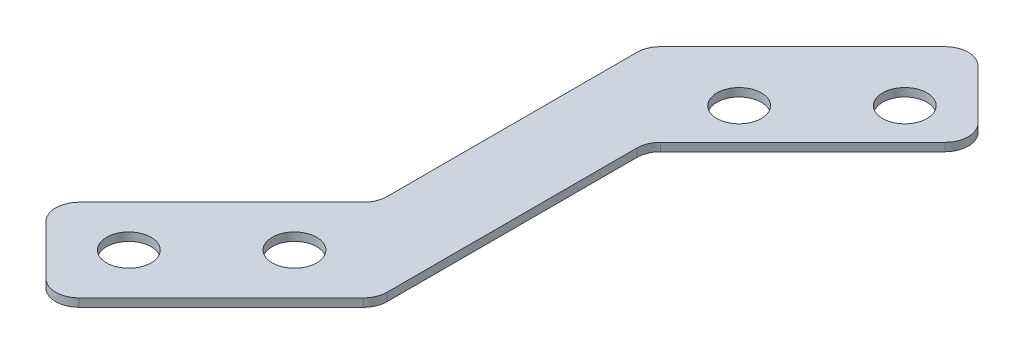
ISO-10303-21;
HEADER;
FILE_DESCRIPTION(('STEP AP214'),'2;1');
FILE_NAME('part.step','',(''),(''),'','','');
FILE_SCHEMA(('AUTOMOTIVE_DESIGN { 1 0 10303 214 1 1 1 1 }'));
ENDSEC;
DATA;
#1=APPLICATION_CONTEXT('core data for automotive mechanical design processes');
#2=APPLICATION_PROTOCOL_DEFINITION('international standard','automotive_design',2000,#1);
#3=PRODUCT_CONTEXT('',#1,'mechanical');
#4=PRODUCT('Part','Part','',(#3));
#5=PRODUCT_RELATED_PRODUCT_CATEGORY('part','',(#4));
#6=PRODUCT_DEFINITION_FORMATION('','',#4);
#7=PRODUCT_DEFINITION_CONTEXT('part definition',#1,'design');
#8=PRODUCT_DEFINITION('design','',#6,#7);
#9=PRODUCT_DEFINITION_SHAPE('','',#8);
#10=(LENGTH_UNIT() NAMED_UNIT(*) SI_UNIT(.MILLI.,.METRE.));
#11=(NAMED_UNIT(*) PLANE_ANGLE_UNIT() SI_UNIT($,.RADIAN.));
#12=(NAMED_UNIT(*) SI_UNIT($,.STERADIAN.) SOLID_ANGLE_UNIT());
#13=UNCERTAINTY_MEASURE_WITH_UNIT(LENGTH_MEASURE(1.E-05),#10,'distance_accuracy_value','');
#14=(GEOMETRIC_REPRESENTATION_CONTEXT(3) GLOBAL_UNCERTAINTY_ASSIGNED_CONTEXT((#13)) GLOBAL_UNIT_ASSIGNED_CONTEXT((#10,
#11,#12)) REPRESENTATION_CONTEXT('',''));
#15=CARTESIAN_POINT('',(0.,0.,0.));
#16=DIRECTION('',(0.,0.,1.));
#17=DIRECTION('',(1.,0.,0.));
#18=AXIS2_PLACEMENT_3D('',#15,#16,#17);
#19=CARTESIAN_POINT('',(-14.142135623731,-0.7,14.1421356237309));
#20=DIRECTION('',(0.707106781186547,0.,0.707106781186549));
#21=DIRECTION('',(0.707106781186549,0.,-0.707106781186547));
#22=AXIS2_PLACEMENT_3D('',#19,#20,#21);
#23=PLANE('',#22);
#24=DIRECTION('',(0.707106781186548,0.,-0.707106781186546));
#25=VECTOR('',#24,1.);
#26=CARTESIAN_POINT('',(-14.142135623731,-0.7,14.1421356237309));
#27=LINE('',#26,#25);
#28=CARTESIAN_POINT('',(-12.7279220613579,-0.7,12.7279220613578));
#29=VERTEX_POINT('',#28);
#30=CARTESIAN_POINT('',(-0.585786437626905,-0.7,0.585786437626903));
#31=VERTEX_POINT('',#30);
#32=EDGE_CURVE('E255',#29,#31,#27,.T.);
#33=ORIENTED_EDGE('',*,*,#32,.T.);
#34=DIRECTION('',(0.,1.,0.));
#35=VECTOR('',#34,1.);
#36=CARTESIAN_POINT('',(-0.585786437626903,-0.7,0.585786437626901));
#37=LINE('',#36,#35);
#38=CARTESIAN_POINT('',(-0.585786437626905,0.,0.585786437626903));
#39=VERTEX_POINT('',#38);
#40=EDGE_CURVE('E230',#31,#39,#37,.T.);
#41=ORIENTED_EDGE('',*,*,#40,.T.);
#42=DIRECTION('',(0.707106781186548,0.,-0.707106781186546));
#43=VECTOR('',#42,1.);
#44=CARTESIAN_POINT('',(-14.142135623731,0.,14.1421356237309));
#45=LINE('',#44,#43);
#46=CARTESIAN_POINT('',(-12.7279220613579,0.,12.7279220613578));
#47=VERTEX_POINT('',#46);
#48=EDGE_CURVE('E272',#47,#39,#45,.T.);
#49=ORIENTED_EDGE('',*,*,#48,.F.);
#50=DIRECTION('',(0.,1.,0.));
#51=VECTOR('',#50,1.);
#52=CARTESIAN_POINT('',(-12.7279220613579,-0.7,12.7279220613578));
#53=LINE('',#52,#51);
#54=EDGE_CURVE('E228',#47,#29,#53,.F.);
#55=ORIENTED_EDGE('',*,*,#54,.T.);
#56=EDGE_LOOP('',(#33,#41,#49,#55));
#57=FACE_BOUND('',#56,.T.);
#58=ADVANCED_FACE('F37',(#57),#23,.T.);
#59=CARTESIAN_POINT('',(-14.142135623731,-0.7,14.1421356237309));
#60=DIRECTION('',(-0.707106781186549,0.,0.707106781186547));
#61=DIRECTION('',(0.707106781186547,0.,0.707106781186549));
#62=AXIS2_PLACEMENT_3D('',#59,#60,#61);
#63=PLANE('',#62);
#64=DIRECTION('',(0.707106781186546,0.,0.707106781186548));
#65=VECTOR('',#64,1.);
#66=CARTESIAN_POINT('',(-14.142135623731,0.,14.1421356237309));
#67=LINE('',#66,#65);
#68=CARTESIAN_POINT('',(-19.7989898732233,0.,8.48528137423854));
#69=VERTEX_POINT('',#68);
#70=CARTESIAN_POINT('',(-15.5563491861041,0.,12.7279220613578));
#71=VERTEX_POINT('',#70);
#72=EDGE_CURVE('E184',#69,#71,#67,.T.);
#73=ORIENTED_EDGE('',*,*,#72,.F.);
#74=DIRECTION('',(0.,1.,0.));
#75=VECTOR('',#74,1.);
#76=CARTESIAN_POINT('',(-19.7989898732233,-0.7,8.48528137423854));
#77=LINE('',#76,#75);
#78=CARTESIAN_POINT('',(-19.7989898732233,-0.7,8.48528137423854));
#79=VERTEX_POINT('',#78);
#80=EDGE_CURVE('E236',#69,#79,#77,.F.);
#81=ORIENTED_EDGE('',*,*,#80,.T.);
#82=DIRECTION('',(0.707106781186546,0.,0.707106781186548));
#83=VECTOR('',#82,1.);
#84=CARTESIAN_POINT('',(-14.142135623731,-0.7,14.1421356237309));
#85=LINE('',#84,#83);
#86=CARTESIAN_POINT('',(-15.5563491861041,-0.7,12.7279220613578));
#87=VERTEX_POINT('',#86);
#88=EDGE_CURVE('E176',#79,#87,#85,.T.);
#89=ORIENTED_EDGE('',*,*,#88,.T.);
#90=DIRECTION('',(0.,1.,0.));
#91=VECTOR('',#90,1.);
#92=CARTESIAN_POINT('',(-15.5563491861041,-0.7,12.7279220613578));
#93=LINE('',#92,#91);
#94=EDGE_CURVE('E233',#87,#71,#93,.T.);
#95=ORIENTED_EDGE('',*,*,#94,.T.);
#96=EDGE_LOOP('',(#73,#81,#89,#95));
#97=FACE_BOUND('',#96,.T.);
#98=ADVANCED_FACE('F289',(#97),#63,.T.);
#99=CARTESIAN_POINT('',(-7.07106781186555,-0.7,-7.0710678118654));
#100=DIRECTION('',(-0.707106781186547,0.,-0.707106781186548));
#101=DIRECTION('',(-0.707106781186548,0.,0.707106781186547));
#102=AXIS2_PLACEMENT_3D('',#99,#100,#101);
#103=PLANE('',#102);
#104=DIRECTION('',(-0.707106781186549,0.,0.707106781186547));
#105=VECTOR('',#104,1.);
#106=CARTESIAN_POINT('',(-7.07106781186555,0.,-7.0710678118654));
#107=LINE('',#106,#105);
#108=CARTESIAN_POINT('',(-7.65685424949246,0.,-6.48528137423849));
#109=VERTEX_POINT('',#108);
#110=CARTESIAN_POINT('',(-19.7989898732233,0.,5.65685424949236));
#111=VERTEX_POINT('',#110);
#112=EDGE_CURVE('E281',#109,#111,#107,.T.);
#113=ORIENTED_EDGE('',*,*,#112,.F.);
#114=DIRECTION('',(0.,1.,0.));
#115=VECTOR('',#114,1.);
#116=CARTESIAN_POINT('',(-7.65685424949246,-0.7,-6.48528137423849));
#117=LINE('',#116,#115);
#118=CARTESIAN_POINT('',(-7.65685424949246,-0.7,-6.48528137423849));
#119=VERTEX_POINT('',#118);
#120=EDGE_CURVE('E222',#109,#119,#117,.F.);
#121=ORIENTED_EDGE('',*,*,#120,.T.);
#122=DIRECTION('',(-0.707106781186549,0.,0.707106781186547));
#123=VECTOR('',#122,1.);
#124=CARTESIAN_POINT('',(-7.07106781186555,-0.7,-7.0710678118654));
#125=LINE('',#124,#123);
#126=CARTESIAN_POINT('',(-19.7989898732233,-0.7,5.65685424949236));
#127=VERTEX_POINT('',#126);
#128=EDGE_CURVE('E181',#119,#127,#125,.T.);
#129=ORIENTED_EDGE('',*,*,#128,.T.);
#130=DIRECTION('',(0.,1.,0.));
#131=VECTOR('',#130,1.);
#132=CARTESIAN_POINT('',(-19.7989898732233,-0.7,5.65685424949235));
#133=LINE('',#132,#131);
#134=EDGE_CURVE('E219',#127,#111,#133,.T.);
#135=ORIENTED_EDGE('',*,*,#134,.T.);
#136=EDGE_LOOP('',(#113,#121,#129,#135));
#137=FACE_BOUND('',#136,.T.);
#138=ADVANCED_FACE('F301',(#137),#103,.T.);
#139=CARTESIAN_POINT('',(-7.07106781186555,-0.7,-30.0710678118656));
#140=DIRECTION('',(-1.,0.,0.));
#141=DIRECTION('',(0.,0.,1.));
#142=AXIS2_PLACEMENT_3D('',#139,#140,#141);
#143=PLANE('',#142);
#144=DIRECTION('',(0.,0.,1.));
#145=VECTOR('',#144,1.);
#146=CARTESIAN_POINT('',(-7.07106781186555,-0.7,-30.0710678118656));
#147=LINE('',#146,#145);
#148=CARTESIAN_POINT('',(-7.07106781186555,-0.7,-29.2426406871194));
#149=VERTEX_POINT('',#148);
#150=CARTESIAN_POINT('',(-7.07106781186555,-0.7,-7.89949493661159));
#151=VERTEX_POINT('',#150);
#152=EDGE_CURVE('E267',#149,#151,#147,.T.);
#153=ORIENTED_EDGE('',*,*,#152,.T.);
#154=DIRECTION('',(0.,1.,0.));
#155=VECTOR('',#154,1.);
#156=CARTESIAN_POINT('',(-7.07106781186555,0.,-7.89949493661159));
#157=LINE('',#156,#155);
#158=CARTESIAN_POINT('',(-7.07106781186555,0.,-7.89949493661159));
#159=VERTEX_POINT('',#158);
#160=EDGE_CURVE('E216',#151,#159,#157,.T.);
#161=ORIENTED_EDGE('',*,*,#160,.T.);
#162=DIRECTION('',(0.,0.,1.));
#163=VECTOR('',#162,1.);
#164=CARTESIAN_POINT('',(-7.07106781186555,0.,-30.0710678118656));
#165=LINE('',#164,#163);
#166=CARTESIAN_POINT('',(-7.07106781186555,0.,-29.2426406871194));
#167=VERTEX_POINT('',#166);
#168=EDGE_CURVE('E279',#167,#159,#165,.T.);
#169=ORIENTED_EDGE('',*,*,#168,.F.);
#170=DIRECTION('',(0.,1.,0.));
#171=VECTOR('',#170,1.);
#172=CARTESIAN_POINT('',(-7.07106781186555,-0.7,-29.2426406871194));
#173=LINE('',#172,#171);
#174=EDGE_CURVE('E214',#167,#149,#173,.F.);
#175=ORIENTED_EDGE('',*,*,#174,.T.);
#176=EDGE_LOOP('',(#153,#161,#169,#175));
#177=FACE_BOUND('',#176,.T.);
#178=ADVANCED_FACE('F309',(#177),#143,.T.);
#179=CARTESIAN_POINT('',(7.07106781186551,-0.7,-44.2132034355964));
#180=DIRECTION('',(-0.707106781186542,0.,-0.707106781186553));
#181=DIRECTION('',(-0.707106781186553,0.,0.707106781186542));
#182=AXIS2_PLACEMENT_3D('',#179,#180,#181);
#183=PLANE('',#182);
#184=DIRECTION('',(-0.707106781186553,0.,0.707106781186542));
#185=VECTOR('',#184,1.);
#186=CARTESIAN_POINT('',(7.07106781186551,0.,-44.2132034355964));
#187=LINE('',#186,#185);
#188=CARTESIAN_POINT('',(5.65685424949241,0.,-42.7989898732233));
#189=VERTEX_POINT('',#188);
#190=CARTESIAN_POINT('',(-6.48528137423863,0.,-30.6568542494925));
#191=VERTEX_POINT('',#190);
#192=EDGE_CURVE('E171',#189,#191,#187,.T.);
#193=ORIENTED_EDGE('',*,*,#192,.F.);
#194=DIRECTION('',(0.,1.,0.));
#195=VECTOR('',#194,1.);
#196=CARTESIAN_POINT('',(5.65685424949241,-0.7,-42.7989898732233));
#197=LINE('',#196,#195);
#198=CARTESIAN_POINT('',(5.65685424949241,-0.7,-42.7989898732233));
#199=VERTEX_POINT('',#198);
#200=EDGE_CURVE('E197',#189,#199,#197,.F.);
#201=ORIENTED_EDGE('',*,*,#200,.T.);
#202=DIRECTION('',(-0.707106781186553,0.,0.707106781186542));
#203=VECTOR('',#202,1.);
#204=CARTESIAN_POINT('',(7.07106781186551,-0.7,-44.2132034355964));
#205=LINE('',#204,#203);
#206=CARTESIAN_POINT('',(-6.48528137423863,-0.7,-30.6568542494925));
#207=VERTEX_POINT('',#206);
#208=EDGE_CURVE('E264',#199,#207,#205,.T.);
#209=ORIENTED_EDGE('',*,*,#208,.T.);
#210=DIRECTION('',(0.,1.,0.));
#211=VECTOR('',#210,1.);
#212=CARTESIAN_POINT('',(-6.48528137423863,-0.7,-30.6568542494925));
#213=LINE('',#212,#211);
#214=EDGE_CURVE('E194',#207,#191,#213,.T.);
#215=ORIENTED_EDGE('',*,*,#214,.T.);
#216=EDGE_LOOP('',(#193,#201,#209,#215));
#217=FACE_BOUND('',#216,.T.);
#218=ADVANCED_FACE('F318',(#217),#183,.T.);
#219=CARTESIAN_POINT('',(14.142135623731,-0.7,-37.1421356237309));
#220=DIRECTION('',(0.707106781186549,0.,-0.707106781186546));
#221=DIRECTION('',(-0.707106781186546,0.,-0.707106781186549));
#222=AXIS2_PLACEMENT_3D('',#219,#220,#221);
#223=PLANE('',#222);
#224=DIRECTION('',(-0.707106781186546,0.,-0.707106781186549));
#225=VECTOR('',#224,1.);
#226=CARTESIAN_POINT('',(14.142135623731,-0.7,-37.1421356237309));
#227=LINE('',#226,#225);
#228=CARTESIAN_POINT('',(12.7279220613579,-0.7,-38.556349186104));
#229=VERTEX_POINT('',#228);
#230=CARTESIAN_POINT('',(8.48528137423859,-0.7,-42.7989898732233));
#231=VERTEX_POINT('',#230);
#232=EDGE_CURVE('E257',#229,#231,#227,.T.);
#233=ORIENTED_EDGE('',*,*,#232,.T.);
#234=DIRECTION('',(0.,1.,0.));
#235=VECTOR('',#234,1.);
#236=CARTESIAN_POINT('',(8.48528137423859,-0.7,-42.7989898732233));
#237=LINE('',#236,#235);
#238=CARTESIAN_POINT('',(8.48528137423859,0.,-42.7989898732233));
#239=VERTEX_POINT('',#238);
#240=EDGE_CURVE('E170',#231,#239,#237,.T.);
#241=ORIENTED_EDGE('',*,*,#240,.T.);
#242=DIRECTION('',(-0.707106781186546,0.,-0.707106781186549));
#243=VECTOR('',#242,1.);
#244=CARTESIAN_POINT('',(14.142135623731,0.,-37.1421356237309));
#245=LINE('',#244,#243);
#246=CARTESIAN_POINT('',(12.7279220613579,0.,-38.556349186104));
#247=VERTEX_POINT('',#246);
#248=EDGE_CURVE('E153',#247,#239,#245,.T.);
#249=ORIENTED_EDGE('',*,*,#248,.F.);
#250=DIRECTION('',(0.,1.,0.));
#251=VECTOR('',#250,1.);
#252=CARTESIAN_POINT('',(12.7279220613579,-0.7,-38.556349186104));
#253=LINE('',#252,#251);
#254=EDGE_CURVE('E167',#247,#229,#253,.F.);
#255=ORIENTED_EDGE('',*,*,#254,.T.);
#256=EDGE_LOOP('',(#233,#241,#249,#255));
#257=FACE_BOUND('',#256,.T.);
#258=ADVANCED_FACE('F166',(#257),#223,.T.);
#259=CARTESIAN_POINT('',(0.,-0.7,-23.));
#260=DIRECTION('',(0.707106781186546,0.,0.707106781186549));
#261=DIRECTION('',(0.707106781186549,0.,-0.707106781186546));
#262=AXIS2_PLACEMENT_3D('',#259,#260,#261);
#263=PLANE('',#262);
#264=DIRECTION('',(0.707106781186549,0.,-0.707106781186546));
#265=VECTOR('',#264,1.);
#266=CARTESIAN_POINT('',(0.,-0.7,-23.));
#267=LINE('',#266,#265);
#268=CARTESIAN_POINT('',(0.585786437626907,-0.7,-23.5857864376269));
#269=VERTEX_POINT('',#268);
#270=CARTESIAN_POINT('',(12.7279220613579,-0.7,-35.7279220613578));
#271=VERTEX_POINT('',#270);
#272=EDGE_CURVE('E254',#269,#271,#267,.T.);
#273=ORIENTED_EDGE('',*,*,#272,.T.);
#274=DIRECTION('',(0.,1.,0.));
#275=VECTOR('',#274,1.);
#276=CARTESIAN_POINT('',(12.7279220613579,-0.7,-35.7279220613578));
#277=LINE('',#276,#275);
#278=CARTESIAN_POINT('',(12.7279220613579,0.,-35.7279220613578));
#279=VERTEX_POINT('',#278);
#280=EDGE_CURVE('E212',#271,#279,#277,.T.);
#281=ORIENTED_EDGE('',*,*,#280,.T.);
#282=DIRECTION('',(0.707106781186549,0.,-0.707106781186546));
#283=VECTOR('',#282,1.);
#284=CARTESIAN_POINT('',(0.,0.,-23.));
#285=LINE('',#284,#283);
#286=CARTESIAN_POINT('',(0.585786437626907,0.,-23.5857864376269));
#287=VERTEX_POINT('',#286);
#288=EDGE_CURVE('E155',#287,#279,#285,.T.);
#289=ORIENTED_EDGE('',*,*,#288,.F.);
#290=DIRECTION('',(0.,1.,0.));
#291=VECTOR('',#290,1.);
#292=CARTESIAN_POINT('',(0.585786437626907,-0.7,-23.5857864376269));
#293=LINE('',#292,#291);
#294=EDGE_CURVE('E210',#287,#269,#293,.F.);
#295=ORIENTED_EDGE('',*,*,#294,.T.);
#296=EDGE_LOOP('',(#273,#281,#289,#295));
#297=FACE_BOUND('',#296,.T.);
#298=ADVANCED_FACE('F248',(#297),#263,.T.);
#299=CARTESIAN_POINT('',(0.,-0.7,0.));
#300=DIRECTION('',(1.,0.,0.));
#301=DIRECTION('',(0.,0.,-1.));
#302=AXIS2_PLACEMENT_3D('',#299,#300,#301);
#303=PLANE('',#302);
#304=DIRECTION('',(0.,0.,-1.));
#305=VECTOR('',#304,1.);
#306=CARTESIAN_POINT('',(0.,-0.7,0.));
#307=LINE('',#306,#305);
#308=CARTESIAN_POINT('',(0.,-0.7,-0.828427124746194));
#309=VERTEX_POINT('',#308);
#310=CARTESIAN_POINT('',(0.,-0.7,-22.1715728752538));
#311=VERTEX_POINT('',#310);
#312=EDGE_CURVE('E252',#309,#311,#307,.T.);
#313=ORIENTED_EDGE('',*,*,#312,.T.);
#314=DIRECTION('',(0.,1.,0.));
#315=VECTOR('',#314,1.);
#316=CARTESIAN_POINT('',(0.,0.,-22.1715728752538));
#317=LINE('',#316,#315);
#318=CARTESIAN_POINT('',(0.,0.,-22.1715728752538));
#319=VERTEX_POINT('',#318);
#320=EDGE_CURVE('E225',#311,#319,#317,.T.);
#321=ORIENTED_EDGE('',*,*,#320,.T.);
#322=DIRECTION('',(0.,0.,-1.));
#323=VECTOR('',#322,1.);
#324=CARTESIAN_POINT('',(0.,0.,0.));
#325=LINE('',#324,#323);
#326=CARTESIAN_POINT('',(0.,0.,-0.828427124746194));
#327=VERTEX_POINT('',#326);
#328=EDGE_CURVE('E242',#327,#319,#325,.T.);
#329=ORIENTED_EDGE('',*,*,#328,.F.);
#330=DIRECTION('',(0.,1.,0.));
#331=VECTOR('',#330,1.);
#332=CARTESIAN_POINT('',(0.,-0.7,-0.828427124746194));
#333=LINE('',#332,#331);
#334=EDGE_CURVE('E57',#327,#309,#333,.F.);
#335=ORIENTED_EDGE('',*,*,#334,.T.);
#336=EDGE_LOOP('',(#313,#321,#329,#335));
#337=FACE_BOUND('',#336,.T.);
#338=ADVANCED_FACE('F251',(#337),#303,.T.);
#339=CARTESIAN_POINT('',(0.,-0.7,0.));
#340=DIRECTION('',(0.,1.,0.));
#341=DIRECTION('',(0.,0.,1.));
#342=AXIS2_PLACEMENT_3D('',#339,#340,#341);
#343=PLANE('',#342);
#344=CARTESIAN_POINT('',(-14.1398215405069,-0.699999999999999,7.07338189508951));
#345=DIRECTION('',(0.,1.,0.));
#346=DIRECTION('',(0.,0.,1.));
#347=AXIS2_PLACEMENT_3D('',#344,#345,#346);
#348=CIRCLE('',#347,1.89864999999999);
#349=CARTESIAN_POINT('',(-14.1398215405069,-0.699999999999999,8.9720318950895));
#350=VERTEX_POINT('',#349);
#351=EDGE_CURVE('E379',#350,#350,#348,.T.);
#352=ORIENTED_EDGE('',*,*,#351,.T.);
#353=EDGE_LOOP('',(#352));
#354=FACE_BOUND('',#353,.T.);
#355=CARTESIAN_POINT('',(-7.06875372864142,-0.699999999999999,0.00231408322403509));
#356=DIRECTION('',(0.,1.,0.));
#357=DIRECTION('',(0.,0.,1.));
#358=AXIS2_PLACEMENT_3D('',#355,#356,#357);
#359=CIRCLE('',#358,1.89864999999999);
#360=CARTESIAN_POINT('',(-7.06875372864142,-0.699999999999999,1.90096408322403));
#361=VERTEX_POINT('',#360);
#362=EDGE_CURVE('E374',#361,#361,#359,.T.);
#363=ORIENTED_EDGE('',*,*,#362,.T.);
#364=EDGE_LOOP('',(#363));
#365=FACE_BOUND('',#364,.T.);
#366=CARTESIAN_POINT('',(1.23743686707645,-0.699999999999999,-29.6538748109654));
#367=DIRECTION('',(0.,1.,0.));
#368=DIRECTION('',(0.,0.,1.));
#369=AXIS2_PLACEMENT_3D('',#366,#367,#368);
#370=CIRCLE('',#369,1.89865);
#371=CARTESIAN_POINT('',(1.23743686707645,-0.699999999999999,-27.7552248109654));
#372=VERTEX_POINT('',#371);
#373=EDGE_CURVE('E390',#372,#372,#370,.T.);
#374=ORIENTED_EDGE('',*,*,#373,.T.);
#375=EDGE_LOOP('',(#374));
#376=FACE_BOUND('',#375,.T.);
#377=CARTESIAN_POINT('',(8.30850467894193,-0.699999999999999,-36.7249426228309));
#378=DIRECTION('',(0.,1.,0.));
#379=DIRECTION('',(0.,0.,1.));
#380=AXIS2_PLACEMENT_3D('',#377,#378,#379);
#381=CIRCLE('',#380,1.89864999999999);
#382=CARTESIAN_POINT('',(8.30850467894193,-0.699999999999999,-34.8262926228309));
#383=VERTEX_POINT('',#382);
#384=EDGE_CURVE('E275',#383,#383,#381,.T.);
#385=ORIENTED_EDGE('',*,*,#384,.T.);
#386=EDGE_LOOP('',(#385));
#387=FACE_BOUND('',#386,.T.);
#388=ORIENTED_EDGE('',*,*,#208,.F.);
#389=CARTESIAN_POINT('',(7.07106781186549,-0.7,-41.3847763108502));
#390=DIRECTION('',(0.,1.,0.));
#391=DIRECTION('',(0.,0.,1.));
#392=AXIS2_PLACEMENT_3D('',#389,#390,#391);
#393=CIRCLE('',#392,2.);
#394=EDGE_CURVE('E208',#199,#231,#393,.F.);
#395=ORIENTED_EDGE('',*,*,#394,.T.);
#396=ORIENTED_EDGE('',*,*,#232,.F.);
#397=CARTESIAN_POINT('',(11.3137084989848,-0.7,-37.1421356237309));
#398=DIRECTION('',(0.,1.,0.));
#399=DIRECTION('',(0.,0.,1.));
#400=AXIS2_PLACEMENT_3D('',#397,#398,#399);
#401=CIRCLE('',#400,2.);
#402=EDGE_CURVE('E175',#229,#271,#401,.F.);
#403=ORIENTED_EDGE('',*,*,#402,.T.);
#404=ORIENTED_EDGE('',*,*,#272,.F.);
#405=CARTESIAN_POINT('',(2.,-0.7,-22.1715728752538));
#406=DIRECTION('',(0.,1.,0.));
#407=DIRECTION('',(0.,0.,1.));
#408=AXIS2_PLACEMENT_3D('',#405,#406,#407);
#409=CIRCLE('',#408,2.);
#410=EDGE_CURVE('E11',#269,#311,#409,.T.);
#411=ORIENTED_EDGE('',*,*,#410,.T.);
#412=ORIENTED_EDGE('',*,*,#312,.F.);
#413=CARTESIAN_POINT('',(-2.,-0.7,-0.828427124746194));
#414=DIRECTION('',(0.,1.,0.));
#415=DIRECTION('',(0.,0.,1.));
#416=AXIS2_PLACEMENT_3D('',#413,#414,#415);
#417=CIRCLE('',#416,2.);
#418=EDGE_CURVE('E203',#309,#31,#417,.F.);
#419=ORIENTED_EDGE('',*,*,#418,.T.);
#420=ORIENTED_EDGE('',*,*,#32,.F.);
#421=CARTESIAN_POINT('',(-14.142135623731,-0.7,11.3137084989847));
#422=DIRECTION('',(0.,1.,0.));
#423=DIRECTION('',(0.,0.,1.));
#424=AXIS2_PLACEMENT_3D('',#421,#422,#423);
#425=CIRCLE('',#424,2.);
#426=EDGE_CURVE('E199',#29,#87,#425,.F.);
#427=ORIENTED_EDGE('',*,*,#426,.T.);
#428=ORIENTED_EDGE('',*,*,#88,.F.);
#429=CARTESIAN_POINT('',(-18.3847763108502,-0.7,7.07106781186545));
#430=DIRECTION('',(0.,1.,0.));
#431=DIRECTION('',(0.,0.,1.));
#432=AXIS2_PLACEMENT_3D('',#429,#430,#431);
#433=CIRCLE('',#432,2.);
#434=EDGE_CURVE('E201',#79,#127,#433,.F.);
#435=ORIENTED_EDGE('',*,*,#434,.T.);
#436=ORIENTED_EDGE('',*,*,#128,.F.);
#437=CARTESIAN_POINT('',(-9.07106781186555,-0.7,-7.89949493661159));
#438=DIRECTION('',(0.,1.,0.));
#439=DIRECTION('',(0.,0.,1.));
#440=AXIS2_PLACEMENT_3D('',#437,#438,#439);
#441=CIRCLE('',#440,2.);
#442=EDGE_CURVE('E240',#119,#151,#441,.T.);
#443=ORIENTED_EDGE('',*,*,#442,.T.);
#444=ORIENTED_EDGE('',*,*,#152,.F.);
#445=CARTESIAN_POINT('',(-5.07106781186555,-0.7,-29.2426406871194));
#446=DIRECTION('',(0.,1.,0.));
#447=DIRECTION('',(0.,0.,1.));
#448=AXIS2_PLACEMENT_3D('',#445,#446,#447);
#449=CIRCLE('',#448,2.);
#450=EDGE_CURVE('E205',#149,#207,#449,.F.);
#451=ORIENTED_EDGE('',*,*,#450,.T.);
#452=EDGE_LOOP('',(#388,#395,#396,#403,#404,#411,#412,#419,#420,#427,#428,#435,#436,#443,#444,#451));
#453=FACE_BOUND('',#452,.T.);
#454=ADVANCED_FACE('F298',(#354,#365,#376,#387,#453),#343,.F.);
#455=CARTESIAN_POINT('',(0.,0.,0.));
#456=DIRECTION('',(0.,1.,0.));
#457=DIRECTION('',(0.,0.,1.));
#458=AXIS2_PLACEMENT_3D('',#455,#456,#457);
#459=PLANE('',#458);
#460=CARTESIAN_POINT('',(-14.1398215405069,0.,7.07338189508951));
#461=DIRECTION('',(0.,1.,0.));
#462=DIRECTION('',(0.,0.,1.));
#463=AXIS2_PLACEMENT_3D('',#460,#461,#462);
#464=CIRCLE('',#463,1.89864999999999);
#465=CARTESIAN_POINT('',(-14.1398215405069,0.,8.9720318950895));
#466=VERTEX_POINT('',#465);
#467=EDGE_CURVE('E384',#466,#466,#464,.T.);
#468=ORIENTED_EDGE('',*,*,#467,.F.);
#469=EDGE_LOOP('',(#468));
#470=FACE_BOUND('',#469,.T.);
#471=CARTESIAN_POINT('',(-7.06875372864142,0.,0.00231408322403509));
#472=DIRECTION('',(0.,1.,0.));
#473=DIRECTION('',(0.,0.,1.));
#474=AXIS2_PLACEMENT_3D('',#471,#472,#473);
#475=CIRCLE('',#474,1.89864999999999);
#476=CARTESIAN_POINT('',(-7.06875372864142,0.,1.90096408322402));
#477=VERTEX_POINT('',#476);
#478=EDGE_CURVE('E377',#477,#477,#475,.T.);
#479=ORIENTED_EDGE('',*,*,#478,.F.);
#480=EDGE_LOOP('',(#479));
#481=FACE_BOUND('',#480,.T.);
#482=CARTESIAN_POINT('',(1.23743686707645,0.,-29.6538748109654));
#483=DIRECTION('',(0.,1.,0.));
#484=DIRECTION('',(0.,0.,1.));
#485=AXIS2_PLACEMENT_3D('',#482,#483,#484);
#486=CIRCLE('',#485,1.89864999999999);
#487=CARTESIAN_POINT('',(1.23743686707645,0.,-27.7552248109654));
#488=VERTEX_POINT('',#487);
#489=EDGE_CURVE('E381',#488,#488,#486,.T.);
#490=ORIENTED_EDGE('',*,*,#489,.F.);
#491=EDGE_LOOP('',(#490));
#492=FACE_BOUND('',#491,.T.);
#493=CARTESIAN_POINT('',(8.30850467894193,0.,-36.7249426228309));
#494=DIRECTION('',(0.,1.,0.));
#495=DIRECTION('',(0.,0.,1.));
#496=AXIS2_PLACEMENT_3D('',#493,#494,#495);
#497=CIRCLE('',#496,1.89864999999999);
#498=CARTESIAN_POINT('',(8.30850467894193,0.,-34.8262926228309));
#499=VERTEX_POINT('',#498);
#500=EDGE_CURVE('E393',#499,#499,#497,.T.);
#501=ORIENTED_EDGE('',*,*,#500,.F.);
#502=EDGE_LOOP('',(#501));
#503=FACE_BOUND('',#502,.T.);
#504=ORIENTED_EDGE('',*,*,#248,.T.);
#505=CARTESIAN_POINT('',(7.07106781186549,0.,-41.3847763108502));
#506=DIRECTION('',(0.,1.,0.));
#507=DIRECTION('',(0.,0.,1.));
#508=AXIS2_PLACEMENT_3D('',#505,#506,#507);
#509=CIRCLE('',#508,2.);
#510=EDGE_CURVE('E160',#239,#189,#509,.T.);
#511=ORIENTED_EDGE('',*,*,#510,.T.);
#512=ORIENTED_EDGE('',*,*,#192,.T.);
#513=CARTESIAN_POINT('',(-5.07106781186555,0.,-29.2426406871194));
#514=DIRECTION('',(0.,1.,0.));
#515=DIRECTION('',(0.,0.,1.));
#516=AXIS2_PLACEMENT_3D('',#513,#514,#515);
#517=CIRCLE('',#516,2.);
#518=EDGE_CURVE('E161',#191,#167,#517,.T.);
#519=ORIENTED_EDGE('',*,*,#518,.T.);
#520=ORIENTED_EDGE('',*,*,#168,.T.);
#521=CARTESIAN_POINT('',(-9.07106781186555,0.,-7.89949493661159));
#522=DIRECTION('',(0.,1.,0.));
#523=DIRECTION('',(0.,0.,1.));
#524=AXIS2_PLACEMENT_3D('',#521,#522,#523);
#525=CIRCLE('',#524,2.);
#526=EDGE_CURVE('E238',#159,#109,#525,.F.);
#527=ORIENTED_EDGE('',*,*,#526,.T.);
#528=ORIENTED_EDGE('',*,*,#112,.T.);
#529=CARTESIAN_POINT('',(-18.3847763108502,0.,7.07106781186545));
#530=DIRECTION('',(0.,1.,0.));
#531=DIRECTION('',(0.,0.,1.));
#532=AXIS2_PLACEMENT_3D('',#529,#530,#531);
#533=CIRCLE('',#532,2.);
#534=EDGE_CURVE('E188',#111,#69,#533,.T.);
#535=ORIENTED_EDGE('',*,*,#534,.T.);
#536=ORIENTED_EDGE('',*,*,#72,.T.);
#537=CARTESIAN_POINT('',(-14.142135623731,0.,11.3137084989847));
#538=DIRECTION('',(0.,1.,0.));
#539=DIRECTION('',(0.,0.,1.));
#540=AXIS2_PLACEMENT_3D('',#537,#538,#539);
#541=CIRCLE('',#540,2.);
#542=EDGE_CURVE('E178',#71,#47,#541,.T.);
#543=ORIENTED_EDGE('',*,*,#542,.T.);
#544=ORIENTED_EDGE('',*,*,#48,.T.);
#545=CARTESIAN_POINT('',(-2.,0.,-0.828427124746194));
#546=DIRECTION('',(0.,1.,0.));
#547=DIRECTION('',(0.,0.,1.));
#548=AXIS2_PLACEMENT_3D('',#545,#546,#547);
#549=CIRCLE('',#548,2.);
#550=EDGE_CURVE('E190',#39,#327,#549,.T.);
#551=ORIENTED_EDGE('',*,*,#550,.T.);
#552=ORIENTED_EDGE('',*,*,#328,.T.);
#553=CARTESIAN_POINT('',(2.,0.,-22.1715728752538));
#554=DIRECTION('',(0.,1.,0.));
#555=DIRECTION('',(0.,0.,1.));
#556=AXIS2_PLACEMENT_3D('',#553,#554,#555);
#557=CIRCLE('',#556,2.);
#558=EDGE_CURVE('E45',#319,#287,#557,.F.);
#559=ORIENTED_EDGE('',*,*,#558,.T.);
#560=ORIENTED_EDGE('',*,*,#288,.T.);
#561=CARTESIAN_POINT('',(11.3137084989848,0.,-37.1421356237309));
#562=DIRECTION('',(0.,1.,0.));
#563=DIRECTION('',(0.,0.,1.));
#564=AXIS2_PLACEMENT_3D('',#561,#562,#563);
#565=CIRCLE('',#564,2.);
#566=EDGE_CURVE('E150',#279,#247,#565,.T.);
#567=ORIENTED_EDGE('',*,*,#566,.T.);
#568=EDGE_LOOP('',(#504,#511,#512,#519,#520,#527,#528,#535,#536,#543,#544,#551,#552,#559,#560,#567));
#569=FACE_BOUND('',#568,.T.);
#570=ADVANCED_FACE('F152',(#470,#481,#492,#503,#569),#459,.T.);
#571=CARTESIAN_POINT('',(8.30850467894193,0.,-36.7249426228309));
#572=DIRECTION('',(0.,1.,0.));
#573=DIRECTION('',(0.,0.,1.));
#574=AXIS2_PLACEMENT_3D('',#571,#572,#573);
#575=CYLINDRICAL_SURFACE('',#574,1.89864999999999);
#576=ORIENTED_EDGE('',*,*,#384,.F.);
#577=EDGE_LOOP('',(#576));
#578=FACE_BOUND('',#577,.T.);
#579=ORIENTED_EDGE('',*,*,#500,.T.);
#580=EDGE_LOOP('',(#579));
#581=FACE_BOUND('',#580,.T.);
#582=ADVANCED_FACE('F355',(#578,#581),#575,.F.);
#583=CARTESIAN_POINT('',(1.23743686707645,0.,-29.6538748109654));
#584=DIRECTION('',(0.,1.,0.));
#585=DIRECTION('',(0.,0.,1.));
#586=AXIS2_PLACEMENT_3D('',#583,#584,#585);
#587=CYLINDRICAL_SURFACE('',#586,1.89864999999999);
#588=ORIENTED_EDGE('',*,*,#373,.F.);
#589=EDGE_LOOP('',(#588));
#590=FACE_BOUND('',#589,.T.);
#591=ORIENTED_EDGE('',*,*,#489,.T.);
#592=EDGE_LOOP('',(#591));
#593=FACE_BOUND('',#592,.T.);
#594=ADVANCED_FACE('F362',(#590,#593),#587,.F.);
#595=CARTESIAN_POINT('',(-7.06875372864142,0.,0.00231408322403509));
#596=DIRECTION('',(0.,1.,0.));
#597=DIRECTION('',(0.,0.,1.));
#598=AXIS2_PLACEMENT_3D('',#595,#596,#597);
#599=CYLINDRICAL_SURFACE('',#598,1.89864999999999);
#600=ORIENTED_EDGE('',*,*,#362,.F.);
#601=EDGE_LOOP('',(#600));
#602=FACE_BOUND('',#601,.T.);
#603=ORIENTED_EDGE('',*,*,#478,.T.);
#604=EDGE_LOOP('',(#603));
#605=FACE_BOUND('',#604,.T.);
#606=ADVANCED_FACE('F330',(#602,#605),#599,.F.);
#607=CARTESIAN_POINT('',(-14.1398215405069,0.,7.07338189508951));
#608=DIRECTION('',(0.,1.,0.));
#609=DIRECTION('',(0.,0.,1.));
#610=AXIS2_PLACEMENT_3D('',#607,#608,#609);
#611=CYLINDRICAL_SURFACE('',#610,1.89864999999999);
#612=ORIENTED_EDGE('',*,*,#351,.F.);
#613=EDGE_LOOP('',(#612));
#614=FACE_BOUND('',#613,.T.);
#615=ORIENTED_EDGE('',*,*,#467,.T.);
#616=EDGE_LOOP('',(#615));
#617=FACE_BOUND('',#616,.T.);
#618=ADVANCED_FACE('F323',(#614,#617),#611,.F.);
#619=CARTESIAN_POINT('',(7.07106781186549,-0.7,-41.3847763108502));
#620=DIRECTION('',(0.,1.,0.));
#621=DIRECTION('',(0.,0.,1.));
#622=AXIS2_PLACEMENT_3D('',#619,#620,#621);
#623=CYLINDRICAL_SURFACE('',#622,2.);
#624=ORIENTED_EDGE('',*,*,#394,.F.);
#625=ORIENTED_EDGE('',*,*,#200,.F.);
#626=ORIENTED_EDGE('',*,*,#510,.F.);
#627=ORIENTED_EDGE('',*,*,#240,.F.);
#628=EDGE_LOOP('',(#624,#625,#626,#627));
#629=FACE_BOUND('',#628,.T.);
#630=ADVANCED_FACE('F321',(#629),#623,.T.);
#631=CARTESIAN_POINT('',(11.3137084989848,-0.7,-37.1421356237309));
#632=DIRECTION('',(0.,1.,0.));
#633=DIRECTION('',(0.,0.,1.));
#634=AXIS2_PLACEMENT_3D('',#631,#632,#633);
#635=CYLINDRICAL_SURFACE('',#634,2.);
#636=ORIENTED_EDGE('',*,*,#402,.F.);
#637=ORIENTED_EDGE('',*,*,#254,.F.);
#638=ORIENTED_EDGE('',*,*,#566,.F.);
#639=ORIENTED_EDGE('',*,*,#280,.F.);
#640=EDGE_LOOP('',(#636,#637,#638,#639));
#641=FACE_BOUND('',#640,.T.);
#642=ADVANCED_FACE('F174',(#641),#635,.T.);
#643=CARTESIAN_POINT('',(-9.07106781186555,-0.7,-7.89949493661159));
#644=DIRECTION('',(0.,-1.,0.));
#645=DIRECTION('',(0.,0.,-1.));
#646=AXIS2_PLACEMENT_3D('',#643,#644,#645);
#647=CYLINDRICAL_SURFACE('',#646,2.);
#648=ORIENTED_EDGE('',*,*,#442,.F.);
#649=ORIENTED_EDGE('',*,*,#120,.F.);
#650=ORIENTED_EDGE('',*,*,#526,.F.);
#651=ORIENTED_EDGE('',*,*,#160,.F.);
#652=EDGE_LOOP('',(#648,#649,#650,#651));
#653=FACE_BOUND('',#652,.T.);
#654=ADVANCED_FACE('F304',(#653),#647,.F.);
#655=CARTESIAN_POINT('',(2.,-0.7,-22.1715728752538));
#656=DIRECTION('',(0.,-1.,0.));
#657=DIRECTION('',(0.,0.,-1.));
#658=AXIS2_PLACEMENT_3D('',#655,#656,#657);
#659=CYLINDRICAL_SURFACE('',#658,2.);
#660=ORIENTED_EDGE('',*,*,#410,.F.);
#661=ORIENTED_EDGE('',*,*,#294,.F.);
#662=ORIENTED_EDGE('',*,*,#558,.F.);
#663=ORIENTED_EDGE('',*,*,#320,.F.);
#664=EDGE_LOOP('',(#660,#661,#662,#663));
#665=FACE_BOUND('',#664,.T.);
#666=ADVANCED_FACE('F250',(#665),#659,.F.);
#667=CARTESIAN_POINT('',(-5.07106781186555,-0.7,-29.2426406871194));
#668=DIRECTION('',(0.,1.,0.));
#669=DIRECTION('',(0.,0.,1.));
#670=AXIS2_PLACEMENT_3D('',#667,#668,#669);
#671=CYLINDRICAL_SURFACE('',#670,2.);
#672=ORIENTED_EDGE('',*,*,#450,.F.);
#673=ORIENTED_EDGE('',*,*,#174,.F.);
#674=ORIENTED_EDGE('',*,*,#518,.F.);
#675=ORIENTED_EDGE('',*,*,#214,.F.);
#676=EDGE_LOOP('',(#672,#673,#674,#675));
#677=FACE_BOUND('',#676,.T.);
#678=ADVANCED_FACE('F313',(#677),#671,.T.);
#679=CARTESIAN_POINT('',(-2.,-0.7,-0.828427124746194));
#680=DIRECTION('',(0.,1.,0.));
#681=DIRECTION('',(0.,0.,1.));
#682=AXIS2_PLACEMENT_3D('',#679,#680,#681);
#683=CYLINDRICAL_SURFACE('',#682,2.);
#684=ORIENTED_EDGE('',*,*,#418,.F.);
#685=ORIENTED_EDGE('',*,*,#334,.F.);
#686=ORIENTED_EDGE('',*,*,#550,.F.);
#687=ORIENTED_EDGE('',*,*,#40,.F.);
#688=EDGE_LOOP('',(#684,#685,#686,#687));
#689=FACE_BOUND('',#688,.T.);
#690=ADVANCED_FACE('F521',(#689),#683,.T.);
#691=CARTESIAN_POINT('',(-18.3847763108502,-0.7,7.07106781186545));
#692=DIRECTION('',(0.,1.,0.));
#693=DIRECTION('',(0.,0.,1.));
#694=AXIS2_PLACEMENT_3D('',#691,#692,#693);
#695=CYLINDRICAL_SURFACE('',#694,2.);
#696=ORIENTED_EDGE('',*,*,#434,.F.);
#697=ORIENTED_EDGE('',*,*,#80,.F.);
#698=ORIENTED_EDGE('',*,*,#534,.F.);
#699=ORIENTED_EDGE('',*,*,#134,.F.);
#700=EDGE_LOOP('',(#696,#697,#698,#699));
#701=FACE_BOUND('',#700,.T.);
#702=ADVANCED_FACE('F294',(#701),#695,.T.);
#703=CARTESIAN_POINT('',(-14.142135623731,-0.7,11.3137084989847));
#704=DIRECTION('',(0.,1.,0.));
#705=DIRECTION('',(0.,0.,1.));
#706=AXIS2_PLACEMENT_3D('',#703,#704,#705);
#707=CYLINDRICAL_SURFACE('',#706,2.);
#708=ORIENTED_EDGE('',*,*,#426,.F.);
#709=ORIENTED_EDGE('',*,*,#54,.F.);
#710=ORIENTED_EDGE('',*,*,#542,.F.);
#711=ORIENTED_EDGE('',*,*,#94,.F.);
#712=EDGE_LOOP('',(#708,#709,#710,#711));
#713=FACE_BOUND('',#712,.T.);
#714=ADVANCED_FACE('F39',(#713),#707,.T.);
#715=CLOSED_SHELL('',(#58,#98,#138,#178,#218,#258,#298,#338,#454,#570,#582,#594,#606,#618,#630,
#642,#654,#666,#678,#690,#702,#714));
#716=MANIFOLD_SOLID_BREP('B2',#715);
#717=ADVANCED_BREP_SHAPE_REPRESENTATION('',(#18,#716),#14);
#718=SHAPE_DEFINITION_REPRESENTATION(#9,#717);
ENDSEC;
END-ISO-10303-21;
